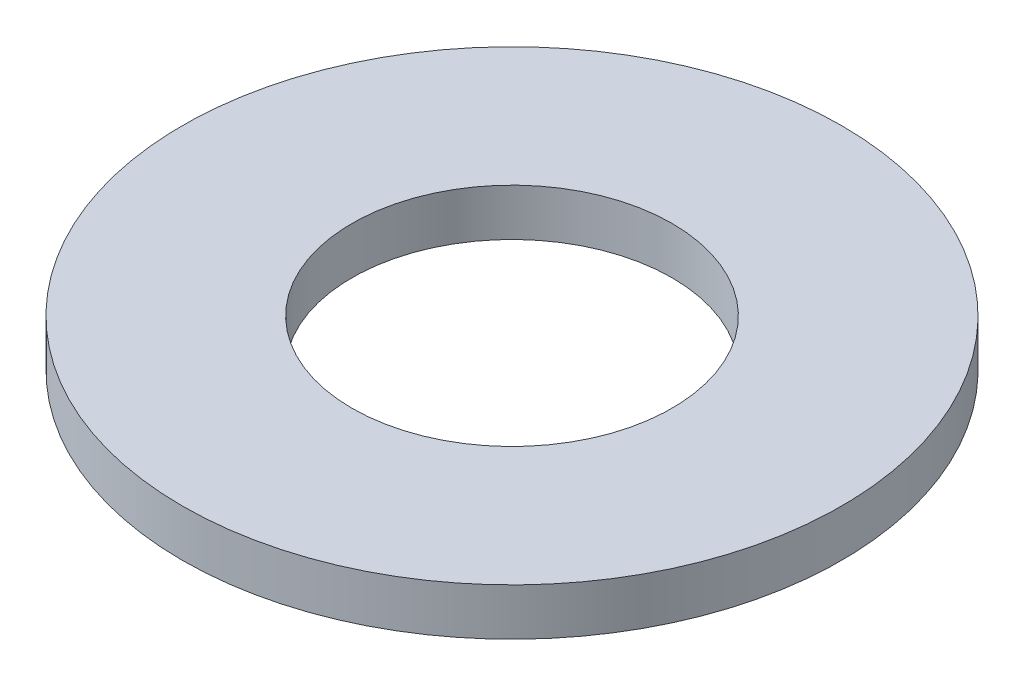
ISO-10303-21;
HEADER;
FILE_DESCRIPTION(('STEP AP214'),'2;1');
FILE_NAME('part.step','',(''),(''),'','','');
FILE_SCHEMA(('AUTOMOTIVE_DESIGN { 1 0 10303 214 1 1 1 1 }'));
ENDSEC;
DATA;
#1=APPLICATION_CONTEXT('core data for automotive mechanical design processes');
#2=APPLICATION_PROTOCOL_DEFINITION('international standard','automotive_design',2000,#1);
#3=PRODUCT_CONTEXT('',#1,'mechanical');
#4=PRODUCT('Part','Part','',(#3));
#5=PRODUCT_RELATED_PRODUCT_CATEGORY('part','',(#4));
#6=PRODUCT_DEFINITION_FORMATION('','',#4);
#7=PRODUCT_DEFINITION_CONTEXT('part definition',#1,'design');
#8=PRODUCT_DEFINITION('design','',#6,#7);
#9=PRODUCT_DEFINITION_SHAPE('','',#8);
#10=(LENGTH_UNIT() NAMED_UNIT(*) SI_UNIT(.MILLI.,.METRE.));
#11=(NAMED_UNIT(*) PLANE_ANGLE_UNIT() SI_UNIT($,.RADIAN.));
#12=(NAMED_UNIT(*) SI_UNIT($,.STERADIAN.) SOLID_ANGLE_UNIT());
#13=UNCERTAINTY_MEASURE_WITH_UNIT(LENGTH_MEASURE(1.E-05),#10,'distance_accuracy_value','');
#14=(GEOMETRIC_REPRESENTATION_CONTEXT(3) GLOBAL_UNCERTAINTY_ASSIGNED_CONTEXT((#13)) GLOBAL_UNIT_ASSIGNED_CONTEXT((#10,
#11,#12)) REPRESENTATION_CONTEXT('',''));
#15=CARTESIAN_POINT('',(0.,0.,0.));
#16=DIRECTION('',(0.,0.,1.));
#17=DIRECTION('',(1.,0.,0.));
#18=AXIS2_PLACEMENT_3D('',#15,#16,#17);
#19=CARTESIAN_POINT('',(0.,0.,0.));
#20=DIRECTION('',(0.,-1.,0.));
#21=DIRECTION('',(0.,0.,-1.));
#22=AXIS2_PLACEMENT_3D('',#19,#20,#21);
#23=CYLINDRICAL_SURFACE('',#22,1.7);
#24=CARTESIAN_POINT('',(0.,9.14450704225353,0.));
#25=DIRECTION('',(0.,-1.,0.));
#26=DIRECTION('',(0.,0.,-1.));
#27=AXIS2_PLACEMENT_3D('',#24,#25,#26);
#28=CIRCLE('',#27,1.7);
#29=CARTESIAN_POINT('',(0.,9.14450704225353,-1.7));
#30=VERTEX_POINT('',#29);
#31=EDGE_CURVE('E10',#30,#30,#28,.T.);
#32=ORIENTED_EDGE('',*,*,#31,.F.);
#33=EDGE_LOOP('',(#32));
#34=FACE_BOUND('',#33,.T.);
#35=CARTESIAN_POINT('',(0.,8.64450704225353,0.));
#36=DIRECTION('',(0.,-1.,0.));
#37=DIRECTION('',(0.,0.,-1.));
#38=AXIS2_PLACEMENT_3D('',#35,#36,#37);
#39=CIRCLE('',#38,1.7);
#40=CARTESIAN_POINT('',(0.,8.64450704225353,-1.7));
#41=VERTEX_POINT('',#40);
#42=EDGE_CURVE('E54',#41,#41,#39,.T.);
#43=ORIENTED_EDGE('',*,*,#42,.T.);
#44=EDGE_LOOP('',(#43));
#45=FACE_BOUND('',#44,.T.);
#46=ADVANCED_FACE('F36',(#34,#45),#23,.F.);
#47=CARTESIAN_POINT('',(-1.7,9.14450704225353,0.));
#48=DIRECTION('',(0.,-1.,0.));
#49=DIRECTION('',(0.,0.,-1.));
#50=AXIS2_PLACEMENT_3D('',#47,#48,#49);
#51=PLANE('',#50);
#52=CARTESIAN_POINT('',(0.,9.14450704225353,0.));
#53=DIRECTION('',(0.,-1.,0.));
#54=DIRECTION('',(0.,0.,-1.));
#55=AXIS2_PLACEMENT_3D('',#52,#53,#54);
#56=CIRCLE('',#55,3.5);
#57=CARTESIAN_POINT('',(0.,9.14450704225353,-3.5));
#58=VERTEX_POINT('',#57);
#59=EDGE_CURVE('E42',#58,#58,#56,.T.);
#60=ORIENTED_EDGE('',*,*,#59,.F.);
#61=EDGE_LOOP('',(#60));
#62=FACE_BOUND('',#61,.T.);
#63=ORIENTED_EDGE('',*,*,#31,.T.);
#64=EDGE_LOOP('',(#63));
#65=FACE_BOUND('',#64,.T.);
#66=ADVANCED_FACE('F71',(#62,#65),#51,.F.);
#67=CARTESIAN_POINT('',(0.,0.,0.));
#68=DIRECTION('',(0.,-1.,0.));
#69=DIRECTION('',(0.,0.,-1.));
#70=AXIS2_PLACEMENT_3D('',#67,#68,#69);
#71=CYLINDRICAL_SURFACE('',#70,3.5);
#72=CARTESIAN_POINT('',(0.,8.64450704225353,0.));
#73=DIRECTION('',(0.,-1.,0.));
#74=DIRECTION('',(0.,0.,-1.));
#75=AXIS2_PLACEMENT_3D('',#72,#73,#74);
#76=CIRCLE('',#75,3.5);
#77=CARTESIAN_POINT('',(0.,8.64450704225353,-3.5));
#78=VERTEX_POINT('',#77);
#79=EDGE_CURVE('E47',#78,#78,#76,.T.);
#80=ORIENTED_EDGE('',*,*,#79,.F.);
#81=EDGE_LOOP('',(#80));
#82=FACE_BOUND('',#81,.T.);
#83=ORIENTED_EDGE('',*,*,#59,.T.);
#84=EDGE_LOOP('',(#83));
#85=FACE_BOUND('',#84,.T.);
#86=ADVANCED_FACE('F66',(#82,#85),#71,.T.);
#87=CARTESIAN_POINT('',(-1.7,8.64450704225353,0.));
#88=DIRECTION('',(0.,1.,0.));
#89=DIRECTION('',(0.,0.,1.));
#90=AXIS2_PLACEMENT_3D('',#87,#88,#89);
#91=PLANE('',#90);
#92=ORIENTED_EDGE('',*,*,#42,.F.);
#93=EDGE_LOOP('',(#92));
#94=FACE_BOUND('',#93,.T.);
#95=ORIENTED_EDGE('',*,*,#79,.T.);
#96=EDGE_LOOP('',(#95));
#97=FACE_BOUND('',#96,.T.);
#98=ADVANCED_FACE('F63',(#94,#97),#91,.F.);
#99=CLOSED_SHELL('',(#46,#66,#86,#98));
#100=MANIFOLD_SOLID_BREP('B2',#99);
#101=ADVANCED_BREP_SHAPE_REPRESENTATION('',(#18,#100),#14);
#102=SHAPE_DEFINITION_REPRESENTATION(#9,#101);
ENDSEC;
END-ISO-10303-21;
